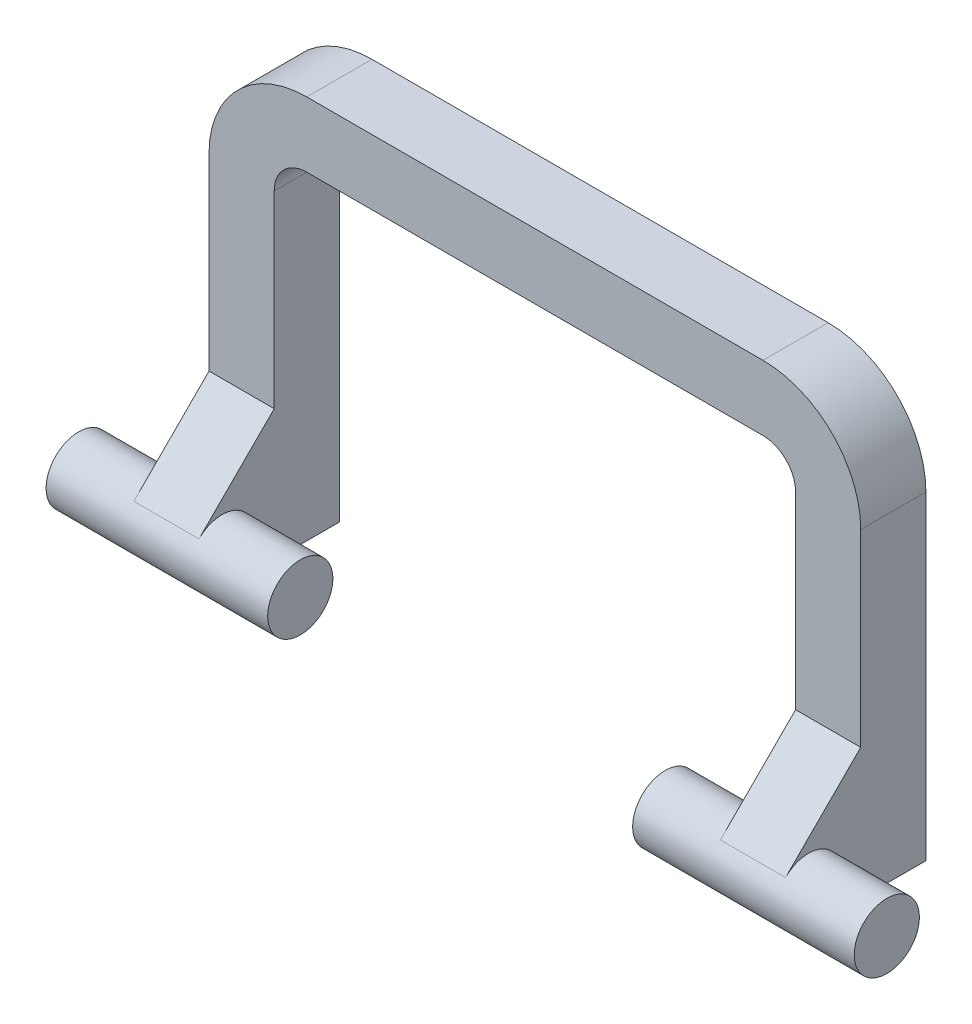
ISO-10303-21;
HEADER;
FILE_DESCRIPTION(('STEP AP214'),'2;1');
FILE_NAME('part.step','',(''),(''),'','','');
FILE_SCHEMA(('AUTOMOTIVE_DESIGN { 1 0 10303 214 1 1 1 1 }'));
ENDSEC;
DATA;
#1=APPLICATION_CONTEXT('core data for automotive mechanical design processes');
#2=APPLICATION_PROTOCOL_DEFINITION('international standard','automotive_design',2000,#1);
#3=PRODUCT_CONTEXT('',#1,'mechanical');
#4=PRODUCT('Part','Part','',(#3));
#5=PRODUCT_RELATED_PRODUCT_CATEGORY('part','',(#4));
#6=PRODUCT_DEFINITION_FORMATION('','',#4);
#7=PRODUCT_DEFINITION_CONTEXT('part definition',#1,'design');
#8=PRODUCT_DEFINITION('design','',#6,#7);
#9=PRODUCT_DEFINITION_SHAPE('','',#8);
#10=(LENGTH_UNIT() NAMED_UNIT(*) SI_UNIT(.MILLI.,.METRE.));
#11=(NAMED_UNIT(*) PLANE_ANGLE_UNIT() SI_UNIT($,.RADIAN.));
#12=(NAMED_UNIT(*) SI_UNIT($,.STERADIAN.) SOLID_ANGLE_UNIT());
#13=UNCERTAINTY_MEASURE_WITH_UNIT(LENGTH_MEASURE(1.E-05),#10,'distance_accuracy_value','');
#14=(GEOMETRIC_REPRESENTATION_CONTEXT(3) GLOBAL_UNCERTAINTY_ASSIGNED_CONTEXT((#13)) GLOBAL_UNIT_ASSIGNED_CONTEXT((#10,
#11,#12)) REPRESENTATION_CONTEXT('',''));
#15=CARTESIAN_POINT('',(0.,0.,0.));
#16=DIRECTION('',(0.,0.,1.));
#17=DIRECTION('',(1.,0.,0.));
#18=AXIS2_PLACEMENT_3D('',#15,#16,#17);
#19=CARTESIAN_POINT('',(35.0000000000001,49.,10.));
#20=DIRECTION('',(0.,0.,1.));
#21=DIRECTION('',(1.,0.,0.));
#22=AXIS2_PLACEMENT_3D('',#19,#20,#21);
#23=PLANE('',#22);
#24=DIRECTION('',(0.,1.,0.));
#25=VECTOR('',#24,1.);
#26=CARTESIAN_POINT('',(-49.9999999999999,0.,10.));
#27=LINE('',#26,#25);
#28=CARTESIAN_POINT('',(-49.9999999999999,20.0710678118656,10.));
#29=VERTEX_POINT('',#28);
#30=CARTESIAN_POINT('',(-49.9999999999999,49.,10.));
#31=VERTEX_POINT('',#30);
#32=EDGE_CURVE('E234',#29,#31,#27,.T.);
#33=ORIENTED_EDGE('',*,*,#32,.F.);
#34=DIRECTION('',(-1.,0.,0.));
#35=VECTOR('',#34,1.);
#36=CARTESIAN_POINT('',(-40.0000000000001,20.0710678118656,10.));
#37=LINE('',#36,#35);
#38=CARTESIAN_POINT('',(-40.0000000000001,20.0710678118656,10.));
#39=VERTEX_POINT('',#38);
#40=EDGE_CURVE('E264',#39,#29,#37,.T.);
#41=ORIENTED_EDGE('',*,*,#40,.F.);
#42=DIRECTION('',(0.,1.,0.));
#43=VECTOR('',#42,1.);
#44=CARTESIAN_POINT('',(-39.9999999999999,0.,10.));
#45=LINE('',#44,#43);
#46=CARTESIAN_POINT('',(-39.9999999999999,49.,10.));
#47=VERTEX_POINT('',#46);
#48=EDGE_CURVE('E135',#39,#47,#45,.T.);
#49=ORIENTED_EDGE('',*,*,#48,.T.);
#50=CARTESIAN_POINT('',(-34.9999999999999,49.,10.));
#51=DIRECTION('',(0.,0.,1.));
#52=DIRECTION('',(1.,0.,0.));
#53=AXIS2_PLACEMENT_3D('',#50,#51,#52);
#54=CIRCLE('',#53,5.);
#55=CARTESIAN_POINT('',(-34.9999999999999,54.,10.));
#56=VERTEX_POINT('',#55);
#57=EDGE_CURVE('E127',#47,#56,#54,.F.);
#58=ORIENTED_EDGE('',*,*,#57,.T.);
#59=DIRECTION('',(1.,0.,0.));
#60=VECTOR('',#59,1.);
#61=CARTESIAN_POINT('',(-34.9999999999999,54.,10.));
#62=LINE('',#61,#60);
#63=CARTESIAN_POINT('',(35.0000000000001,54.,10.));
#64=VERTEX_POINT('',#63);
#65=EDGE_CURVE('E131',#56,#64,#62,.T.);
#66=ORIENTED_EDGE('',*,*,#65,.T.);
#67=CARTESIAN_POINT('',(35.0000000000001,49.,10.));
#68=DIRECTION('',(0.,0.,1.));
#69=DIRECTION('',(1.,0.,0.));
#70=AXIS2_PLACEMENT_3D('',#67,#68,#69);
#71=CIRCLE('',#70,5.);
#72=CARTESIAN_POINT('',(40.0000000000001,49.,10.));
#73=VERTEX_POINT('',#72);
#74=EDGE_CURVE('E57',#64,#73,#71,.F.);
#75=ORIENTED_EDGE('',*,*,#74,.T.);
#76=DIRECTION('',(0.,-1.,0.));
#77=VECTOR('',#76,1.);
#78=CARTESIAN_POINT('',(40.0000000000001,0.,10.));
#79=LINE('',#78,#77);
#80=CARTESIAN_POINT('',(40.0000000000001,20.0710678118656,10.));
#81=VERTEX_POINT('',#80);
#82=EDGE_CURVE('E184',#73,#81,#79,.T.);
#83=ORIENTED_EDGE('',*,*,#82,.T.);
#84=DIRECTION('',(1.,0.,0.));
#85=VECTOR('',#84,1.);
#86=CARTESIAN_POINT('',(40.0000000000001,20.0710678118656,10.));
#87=LINE('',#86,#85);
#88=CARTESIAN_POINT('',(50.0000000000001,20.0710678118656,10.));
#89=VERTEX_POINT('',#88);
#90=EDGE_CURVE('E287',#81,#89,#87,.T.);
#91=ORIENTED_EDGE('',*,*,#90,.T.);
#92=DIRECTION('',(0.,-1.,0.));
#93=VECTOR('',#92,1.);
#94=CARTESIAN_POINT('',(50.0000000000001,0.,10.));
#95=LINE('',#94,#93);
#96=CARTESIAN_POINT('',(50.0000000000001,49.,10.));
#97=VERTEX_POINT('',#96);
#98=EDGE_CURVE('E225',#97,#89,#95,.T.);
#99=ORIENTED_EDGE('',*,*,#98,.F.);
#100=CARTESIAN_POINT('',(35.0000000000001,49.,10.));
#101=DIRECTION('',(0.,0.,1.));
#102=DIRECTION('',(1.,0.,0.));
#103=AXIS2_PLACEMENT_3D('',#100,#101,#102);
#104=CIRCLE('',#103,15.);
#105=CARTESIAN_POINT('',(35.0000000000001,64.,10.));
#106=VERTEX_POINT('',#105);
#107=EDGE_CURVE('E221',#106,#97,#104,.F.);
#108=ORIENTED_EDGE('',*,*,#107,.F.);
#109=DIRECTION('',(1.,0.,0.));
#110=VECTOR('',#109,1.);
#111=CARTESIAN_POINT('',(-34.9999999999999,64.,10.));
#112=LINE('',#111,#110);
#113=CARTESIAN_POINT('',(-34.9999999999999,64.,10.));
#114=VERTEX_POINT('',#113);
#115=EDGE_CURVE('E224',#114,#106,#112,.T.);
#116=ORIENTED_EDGE('',*,*,#115,.F.);
#117=CARTESIAN_POINT('',(-34.9999999999999,49.,10.));
#118=DIRECTION('',(0.,0.,1.));
#119=DIRECTION('',(1.,0.,0.));
#120=AXIS2_PLACEMENT_3D('',#117,#118,#119);
#121=CIRCLE('',#120,15.);
#122=EDGE_CURVE('E227',#31,#114,#121,.F.);
#123=ORIENTED_EDGE('',*,*,#122,.F.);
#124=EDGE_LOOP('',(#33,#41,#49,#58,#66,#75,#83,#91,#99,#108,#116,#123));
#125=FACE_BOUND('',#124,.T.);
#126=ADVANCED_FACE('F33',(#125),#23,.T.);
#127=CARTESIAN_POINT('',(40.0000000000001,0.,10.));
#128=DIRECTION('',(1.,0.,0.));
#129=DIRECTION('',(0.,1.,0.));
#130=AXIS2_PLACEMENT_3D('',#127,#128,#129);
#131=PLANE('',#130);
#132=CARTESIAN_POINT('',(40.0000000000001,4.99999999999999,18.));
#133=DIRECTION('',(-1.,0.,0.));
#134=DIRECTION('',(0.,0.,1.));
#135=AXIS2_PLACEMENT_3D('',#132,#133,#134);
#136=CIRCLE('',#135,5.00000000000001);
#137=CARTESIAN_POINT('',(40.0000000000001,8.53553390593271,21.5355339059328));
#138=VERTEX_POINT('',#137);
#139=CARTESIAN_POINT('',(40.0000000000001,0.,18.));
#140=VERTEX_POINT('',#139);
#141=EDGE_CURVE('E263',#138,#140,#136,.T.);
#142=ORIENTED_EDGE('',*,*,#141,.F.);
#143=DIRECTION('',(0.,-0.707106781186551,0.707106781186544));
#144=VECTOR('',#143,1.);
#145=CARTESIAN_POINT('',(40.0000000000001,8.53553390593273,21.5355339059328));
#146=LINE('',#145,#144);
#147=EDGE_CURVE('E280',#81,#138,#146,.T.);
#148=ORIENTED_EDGE('',*,*,#147,.F.);
#149=ORIENTED_EDGE('',*,*,#82,.F.);
#150=DIRECTION('',(0.,0.,-1.));
#151=VECTOR('',#150,1.);
#152=CARTESIAN_POINT('',(40.0000000000001,49.,10.));
#153=LINE('',#152,#151);
#154=CARTESIAN_POINT('',(40.0000000000001,49.,0.));
#155=VERTEX_POINT('',#154);
#156=EDGE_CURVE('E152',#73,#155,#153,.T.);
#157=ORIENTED_EDGE('',*,*,#156,.T.);
#158=DIRECTION('',(0.,-1.,0.));
#159=VECTOR('',#158,1.);
#160=CARTESIAN_POINT('',(40.0000000000001,0.,0.));
#161=LINE('',#160,#159);
#162=CARTESIAN_POINT('',(40.0000000000001,0.,0.));
#163=VERTEX_POINT('',#162);
#164=EDGE_CURVE('E156',#155,#163,#161,.T.);
#165=ORIENTED_EDGE('',*,*,#164,.T.);
#166=DIRECTION('',(0.,0.,-1.));
#167=VECTOR('',#166,1.);
#168=CARTESIAN_POINT('',(40.0000000000001,0.,10.));
#169=LINE('',#168,#167);
#170=EDGE_CURVE('E11',#140,#163,#169,.T.);
#171=ORIENTED_EDGE('',*,*,#170,.F.);
#172=EDGE_LOOP('',(#142,#148,#149,#157,#165,#171));
#173=FACE_BOUND('',#172,.T.);
#174=ADVANCED_FACE('F35',(#173),#131,.F.);
#175=CARTESIAN_POINT('',(50.0000000000001,0.,10.));
#176=DIRECTION('',(0.,-1.,0.));
#177=DIRECTION('',(1.,0.,0.));
#178=AXIS2_PLACEMENT_3D('',#175,#176,#177);
#179=PLANE('',#178);
#180=DIRECTION('',(-1.,0.,0.));
#181=VECTOR('',#180,1.);
#182=CARTESIAN_POINT('',(50.0000000000001,0.,0.));
#183=LINE('',#182,#181);
#184=CARTESIAN_POINT('',(50.0000000000001,0.,0.));
#185=VERTEX_POINT('',#184);
#186=EDGE_CURVE('E158',#185,#163,#183,.T.);
#187=ORIENTED_EDGE('',*,*,#186,.F.);
#188=DIRECTION('',(0.,0.,-1.));
#189=VECTOR('',#188,1.);
#190=CARTESIAN_POINT('',(50.0000000000001,0.,10.));
#191=LINE('',#190,#189);
#192=CARTESIAN_POINT('',(50.0000000000001,0.,18.));
#193=VERTEX_POINT('',#192);
#194=EDGE_CURVE('E41',#193,#185,#191,.T.);
#195=ORIENTED_EDGE('',*,*,#194,.F.);
#196=DIRECTION('',(1.,0.,0.));
#197=VECTOR('',#196,1.);
#198=CARTESIAN_POINT('',(40.0000000000001,0.,18.));
#199=LINE('',#198,#197);
#200=EDGE_CURVE('E283',#140,#193,#199,.T.);
#201=ORIENTED_EDGE('',*,*,#200,.F.);
#202=ORIENTED_EDGE('',*,*,#170,.T.);
#203=EDGE_LOOP('',(#187,#195,#201,#202));
#204=FACE_BOUND('',#203,.T.);
#205=ADVANCED_FACE('F210',(#204),#179,.T.);
#206=CARTESIAN_POINT('',(50.0000000000001,0.,10.));
#207=DIRECTION('',(1.,0.,0.));
#208=DIRECTION('',(0.,1.,0.));
#209=AXIS2_PLACEMENT_3D('',#206,#207,#208);
#210=PLANE('',#209);
#211=DIRECTION('',(0.,-0.707106781186551,0.707106781186544));
#212=VECTOR('',#211,1.);
#213=CARTESIAN_POINT('',(50.0000000000001,8.53553390593273,21.5355339059328));
#214=LINE('',#213,#212);
#215=CARTESIAN_POINT('',(50.0000000000001,8.53553390593273,21.5355339059328));
#216=VERTEX_POINT('',#215);
#217=EDGE_CURVE('E278',#89,#216,#214,.T.);
#218=ORIENTED_EDGE('',*,*,#217,.T.);
#219=CARTESIAN_POINT('',(50.0000000000001,4.99999999999999,18.));
#220=DIRECTION('',(1.,0.,0.));
#221=DIRECTION('',(0.,0.,-1.));
#222=AXIS2_PLACEMENT_3D('',#219,#220,#221);
#223=CIRCLE('',#222,5.);
#224=EDGE_CURVE('E207',#193,#216,#223,.T.);
#225=ORIENTED_EDGE('',*,*,#224,.F.);
#226=ORIENTED_EDGE('',*,*,#194,.T.);
#227=DIRECTION('',(0.,-1.,0.));
#228=VECTOR('',#227,1.);
#229=CARTESIAN_POINT('',(50.0000000000001,0.,0.));
#230=LINE('',#229,#228);
#231=CARTESIAN_POINT('',(50.0000000000001,49.,0.));
#232=VERTEX_POINT('',#231);
#233=EDGE_CURVE('E162',#232,#185,#230,.T.);
#234=ORIENTED_EDGE('',*,*,#233,.F.);
#235=DIRECTION('',(0.,0.,-1.));
#236=VECTOR('',#235,1.);
#237=CARTESIAN_POINT('',(50.0000000000001,49.,10.));
#238=LINE('',#237,#236);
#239=EDGE_CURVE('E110',#97,#232,#238,.T.);
#240=ORIENTED_EDGE('',*,*,#239,.F.);
#241=ORIENTED_EDGE('',*,*,#98,.T.);
#242=EDGE_LOOP('',(#218,#225,#226,#234,#240,#241));
#243=FACE_BOUND('',#242,.T.);
#244=ADVANCED_FACE('F204',(#243),#210,.T.);
#245=CARTESIAN_POINT('',(35.0000000000001,49.,10.));
#246=DIRECTION('',(0.,0.,-1.));
#247=DIRECTION('',(-1.,0.,0.));
#248=AXIS2_PLACEMENT_3D('',#245,#246,#247);
#249=CYLINDRICAL_SURFACE('',#248,15.);
#250=CARTESIAN_POINT('',(35.0000000000001,49.,0.));
#251=DIRECTION('',(0.,0.,1.));
#252=DIRECTION('',(1.,0.,0.));
#253=AXIS2_PLACEMENT_3D('',#250,#251,#252);
#254=CIRCLE('',#253,15.);
#255=CARTESIAN_POINT('',(35.0000000000001,64.,0.));
#256=VERTEX_POINT('',#255);
#257=EDGE_CURVE('E164',#256,#232,#254,.F.);
#258=ORIENTED_EDGE('',*,*,#257,.F.);
#259=DIRECTION('',(0.,0.,-1.));
#260=VECTOR('',#259,1.);
#261=CARTESIAN_POINT('',(35.0000000000001,64.,10.));
#262=LINE('',#261,#260);
#263=EDGE_CURVE('E197',#106,#256,#262,.T.);
#264=ORIENTED_EDGE('',*,*,#263,.F.);
#265=ORIENTED_EDGE('',*,*,#107,.T.);
#266=ORIENTED_EDGE('',*,*,#239,.T.);
#267=EDGE_LOOP('',(#258,#264,#265,#266));
#268=FACE_BOUND('',#267,.T.);
#269=ADVANCED_FACE('F218',(#268),#249,.T.);
#270=CARTESIAN_POINT('',(-34.9999999999999,64.,10.));
#271=DIRECTION('',(0.,1.,0.));
#272=DIRECTION('',(0.,0.,1.));
#273=AXIS2_PLACEMENT_3D('',#270,#271,#272);
#274=PLANE('',#273);
#275=DIRECTION('',(1.,0.,0.));
#276=VECTOR('',#275,1.);
#277=CARTESIAN_POINT('',(-34.9999999999999,64.,0.));
#278=LINE('',#277,#276);
#279=CARTESIAN_POINT('',(-34.9999999999999,64.,0.));
#280=VERTEX_POINT('',#279);
#281=EDGE_CURVE('E167',#280,#256,#278,.T.);
#282=ORIENTED_EDGE('',*,*,#281,.F.);
#283=DIRECTION('',(0.,0.,-1.));
#284=VECTOR('',#283,1.);
#285=CARTESIAN_POINT('',(-34.9999999999999,64.,10.));
#286=LINE('',#285,#284);
#287=EDGE_CURVE('E195',#114,#280,#286,.T.);
#288=ORIENTED_EDGE('',*,*,#287,.F.);
#289=ORIENTED_EDGE('',*,*,#115,.T.);
#290=ORIENTED_EDGE('',*,*,#263,.T.);
#291=EDGE_LOOP('',(#282,#288,#289,#290));
#292=FACE_BOUND('',#291,.T.);
#293=ADVANCED_FACE('F243',(#292),#274,.T.);
#294=CARTESIAN_POINT('',(-34.9999999999999,49.,10.));
#295=DIRECTION('',(0.,0.,-1.));
#296=DIRECTION('',(-1.,0.,0.));
#297=AXIS2_PLACEMENT_3D('',#294,#295,#296);
#298=CYLINDRICAL_SURFACE('',#297,15.);
#299=CARTESIAN_POINT('',(-34.9999999999999,49.,0.));
#300=DIRECTION('',(0.,0.,1.));
#301=DIRECTION('',(1.,0.,0.));
#302=AXIS2_PLACEMENT_3D('',#299,#300,#301);
#303=CIRCLE('',#302,15.);
#304=CARTESIAN_POINT('',(-49.9999999999999,49.,0.));
#305=VERTEX_POINT('',#304);
#306=EDGE_CURVE('E170',#305,#280,#303,.F.);
#307=ORIENTED_EDGE('',*,*,#306,.F.);
#308=DIRECTION('',(0.,0.,-1.));
#309=VECTOR('',#308,1.);
#310=CARTESIAN_POINT('',(-49.9999999999999,49.,10.));
#311=LINE('',#310,#309);
#312=EDGE_CURVE('E192',#31,#305,#311,.T.);
#313=ORIENTED_EDGE('',*,*,#312,.F.);
#314=ORIENTED_EDGE('',*,*,#122,.T.);
#315=ORIENTED_EDGE('',*,*,#287,.T.);
#316=EDGE_LOOP('',(#307,#313,#314,#315));
#317=FACE_BOUND('',#316,.T.);
#318=ADVANCED_FACE('F241',(#317),#298,.T.);
#319=CARTESIAN_POINT('',(-49.9999999999999,0.,10.));
#320=DIRECTION('',(-1.,0.,0.));
#321=DIRECTION('',(0.,0.,1.));
#322=AXIS2_PLACEMENT_3D('',#319,#320,#321);
#323=PLANE('',#322);
#324=CARTESIAN_POINT('',(-50.0000000000001,4.99999999999999,18.));
#325=DIRECTION('',(1.,0.,0.));
#326=DIRECTION('',(0.,0.,-1.));
#327=AXIS2_PLACEMENT_3D('',#324,#325,#326);
#328=CIRCLE('',#327,5.);
#329=CARTESIAN_POINT('',(-50.0000000000001,0.,18.));
#330=VERTEX_POINT('',#329);
#331=CARTESIAN_POINT('',(-50.0000000000001,8.53553390593272,21.5355339059328));
#332=VERTEX_POINT('',#331);
#333=EDGE_CURVE('E251',#330,#332,#328,.T.);
#334=ORIENTED_EDGE('',*,*,#333,.T.);
#335=DIRECTION('',(0.,-0.707106781186551,0.707106781186544));
#336=VECTOR('',#335,1.);
#337=CARTESIAN_POINT('',(-50.0000000000001,8.53553390593273,21.5355339059328));
#338=LINE('',#337,#336);
#339=EDGE_CURVE('E48',#29,#332,#338,.T.);
#340=ORIENTED_EDGE('',*,*,#339,.F.);
#341=ORIENTED_EDGE('',*,*,#32,.T.);
#342=ORIENTED_EDGE('',*,*,#312,.T.);
#343=DIRECTION('',(0.,1.,0.));
#344=VECTOR('',#343,1.);
#345=CARTESIAN_POINT('',(-49.9999999999999,0.,0.));
#346=LINE('',#345,#344);
#347=CARTESIAN_POINT('',(-49.9999999999999,0.,0.));
#348=VERTEX_POINT('',#347);
#349=EDGE_CURVE('E173',#348,#305,#346,.T.);
#350=ORIENTED_EDGE('',*,*,#349,.F.);
#351=DIRECTION('',(0.,0.,-1.));
#352=VECTOR('',#351,1.);
#353=CARTESIAN_POINT('',(-49.9999999999999,0.,10.));
#354=LINE('',#353,#352);
#355=EDGE_CURVE('E190',#330,#348,#354,.T.);
#356=ORIENTED_EDGE('',*,*,#355,.F.);
#357=EDGE_LOOP('',(#334,#340,#341,#342,#350,#356));
#358=FACE_BOUND('',#357,.T.);
#359=ADVANCED_FACE('F236',(#358),#323,.T.);
#360=CARTESIAN_POINT('',(-39.9999999999999,0.,10.));
#361=DIRECTION('',(0.,-1.,0.));
#362=DIRECTION('',(0.,0.,-1.));
#363=AXIS2_PLACEMENT_3D('',#360,#361,#362);
#364=PLANE('',#363);
#365=DIRECTION('',(-1.,0.,0.));
#366=VECTOR('',#365,1.);
#367=CARTESIAN_POINT('',(-39.9999999999999,0.,0.));
#368=LINE('',#367,#366);
#369=CARTESIAN_POINT('',(-39.9999999999999,0.,0.));
#370=VERTEX_POINT('',#369);
#371=EDGE_CURVE('E175',#370,#348,#368,.T.);
#372=ORIENTED_EDGE('',*,*,#371,.F.);
#373=DIRECTION('',(0.,0.,-1.));
#374=VECTOR('',#373,1.);
#375=CARTESIAN_POINT('',(-39.9999999999999,0.,10.));
#376=LINE('',#375,#374);
#377=CARTESIAN_POINT('',(-40.0000000000001,0.,18.));
#378=VERTEX_POINT('',#377);
#379=EDGE_CURVE('E188',#378,#370,#376,.T.);
#380=ORIENTED_EDGE('',*,*,#379,.F.);
#381=DIRECTION('',(-1.,0.,0.));
#382=VECTOR('',#381,1.);
#383=CARTESIAN_POINT('',(-40.0000000000001,0.,18.));
#384=LINE('',#383,#382);
#385=EDGE_CURVE('E258',#378,#330,#384,.T.);
#386=ORIENTED_EDGE('',*,*,#385,.T.);
#387=ORIENTED_EDGE('',*,*,#355,.T.);
#388=EDGE_LOOP('',(#372,#380,#386,#387));
#389=FACE_BOUND('',#388,.T.);
#390=ADVANCED_FACE('F259',(#389),#364,.T.);
#391=CARTESIAN_POINT('',(-39.9999999999999,0.,10.));
#392=DIRECTION('',(-1.,0.,0.));
#393=DIRECTION('',(0.,0.,1.));
#394=AXIS2_PLACEMENT_3D('',#391,#392,#393);
#395=PLANE('',#394);
#396=DIRECTION('',(0.,-0.707106781186551,0.707106781186544));
#397=VECTOR('',#396,1.);
#398=CARTESIAN_POINT('',(-40.0000000000001,8.53553390593273,21.5355339059328));
#399=LINE('',#398,#397);
#400=CARTESIAN_POINT('',(-40.0000000000001,8.53553390593273,21.5355339059328));
#401=VERTEX_POINT('',#400);
#402=EDGE_CURVE('E276',#39,#401,#399,.T.);
#403=ORIENTED_EDGE('',*,*,#402,.T.);
#404=CARTESIAN_POINT('',(-40.0000000000001,4.99999999999999,18.));
#405=DIRECTION('',(-1.,0.,0.));
#406=DIRECTION('',(0.,0.,1.));
#407=AXIS2_PLACEMENT_3D('',#404,#405,#406);
#408=CIRCLE('',#407,5.00000000000001);
#409=EDGE_CURVE('E316',#401,#378,#408,.T.);
#410=ORIENTED_EDGE('',*,*,#409,.T.);
#411=ORIENTED_EDGE('',*,*,#379,.T.);
#412=DIRECTION('',(0.,1.,0.));
#413=VECTOR('',#412,1.);
#414=CARTESIAN_POINT('',(-39.9999999999999,0.,0.));
#415=LINE('',#414,#413);
#416=CARTESIAN_POINT('',(-39.9999999999999,49.,0.));
#417=VERTEX_POINT('',#416);
#418=EDGE_CURVE('E178',#370,#417,#415,.T.);
#419=ORIENTED_EDGE('',*,*,#418,.T.);
#420=DIRECTION('',(0.,0.,-1.));
#421=VECTOR('',#420,1.);
#422=CARTESIAN_POINT('',(-39.9999999999999,49.,10.));
#423=LINE('',#422,#421);
#424=EDGE_CURVE('E147',#47,#417,#423,.T.);
#425=ORIENTED_EDGE('',*,*,#424,.F.);
#426=ORIENTED_EDGE('',*,*,#48,.F.);
#427=EDGE_LOOP('',(#403,#410,#411,#419,#425,#426));
#428=FACE_BOUND('',#427,.T.);
#429=ADVANCED_FACE('F334',(#428),#395,.F.);
#430=CARTESIAN_POINT('',(-34.9999999999999,49.,10.));
#431=DIRECTION('',(0.,0.,-1.));
#432=DIRECTION('',(-1.,0.,0.));
#433=AXIS2_PLACEMENT_3D('',#430,#431,#432);
#434=CYLINDRICAL_SURFACE('',#433,5.);
#435=CARTESIAN_POINT('',(-34.9999999999999,49.,0.));
#436=DIRECTION('',(0.,0.,1.));
#437=DIRECTION('',(1.,0.,0.));
#438=AXIS2_PLACEMENT_3D('',#435,#436,#437);
#439=CIRCLE('',#438,5.);
#440=CARTESIAN_POINT('',(-34.9999999999999,54.,0.));
#441=VERTEX_POINT('',#440);
#442=EDGE_CURVE('E144',#417,#441,#439,.F.);
#443=ORIENTED_EDGE('',*,*,#442,.T.);
#444=DIRECTION('',(0.,0.,-1.));
#445=VECTOR('',#444,1.);
#446=CARTESIAN_POINT('',(-34.9999999999999,54.,10.));
#447=LINE('',#446,#445);
#448=EDGE_CURVE('E141',#56,#441,#447,.T.);
#449=ORIENTED_EDGE('',*,*,#448,.F.);
#450=ORIENTED_EDGE('',*,*,#57,.F.);
#451=ORIENTED_EDGE('',*,*,#424,.T.);
#452=EDGE_LOOP('',(#443,#449,#450,#451));
#453=FACE_BOUND('',#452,.T.);
#454=ADVANCED_FACE('F142',(#453),#434,.F.);
#455=CARTESIAN_POINT('',(-34.9999999999999,54.,10.));
#456=DIRECTION('',(0.,1.,0.));
#457=DIRECTION('',(0.,0.,1.));
#458=AXIS2_PLACEMENT_3D('',#455,#456,#457);
#459=PLANE('',#458);
#460=DIRECTION('',(1.,0.,0.));
#461=VECTOR('',#460,1.);
#462=CARTESIAN_POINT('',(-34.9999999999999,54.,0.));
#463=LINE('',#462,#461);
#464=CARTESIAN_POINT('',(35.0000000000001,54.,0.));
#465=VERTEX_POINT('',#464);
#466=EDGE_CURVE('E181',#441,#465,#463,.T.);
#467=ORIENTED_EDGE('',*,*,#466,.T.);
#468=DIRECTION('',(0.,0.,-1.));
#469=VECTOR('',#468,1.);
#470=CARTESIAN_POINT('',(35.0000000000001,54.,10.));
#471=LINE('',#470,#469);
#472=EDGE_CURVE('E148',#64,#465,#471,.T.);
#473=ORIENTED_EDGE('',*,*,#472,.F.);
#474=ORIENTED_EDGE('',*,*,#65,.F.);
#475=ORIENTED_EDGE('',*,*,#448,.T.);
#476=EDGE_LOOP('',(#467,#473,#474,#475));
#477=FACE_BOUND('',#476,.T.);
#478=ADVANCED_FACE('F150',(#477),#459,.F.);
#479=CARTESIAN_POINT('',(35.0000000000001,49.,10.));
#480=DIRECTION('',(0.,0.,-1.));
#481=DIRECTION('',(-1.,0.,0.));
#482=AXIS2_PLACEMENT_3D('',#479,#480,#481);
#483=CYLINDRICAL_SURFACE('',#482,5.);
#484=CARTESIAN_POINT('',(35.0000000000001,49.,0.));
#485=DIRECTION('',(0.,0.,1.));
#486=DIRECTION('',(1.,0.,0.));
#487=AXIS2_PLACEMENT_3D('',#484,#485,#486);
#488=CIRCLE('',#487,5.);
#489=EDGE_CURVE('E102',#465,#155,#488,.F.);
#490=ORIENTED_EDGE('',*,*,#489,.T.);
#491=ORIENTED_EDGE('',*,*,#156,.F.);
#492=ORIENTED_EDGE('',*,*,#74,.F.);
#493=ORIENTED_EDGE('',*,*,#472,.T.);
#494=EDGE_LOOP('',(#490,#491,#492,#493));
#495=FACE_BOUND('',#494,.T.);
#496=ADVANCED_FACE('F337',(#495),#483,.F.);
#497=CARTESIAN_POINT('',(35.0000000000001,49.,0.));
#498=DIRECTION('',(0.,0.,1.));
#499=DIRECTION('',(1.,0.,0.));
#500=AXIS2_PLACEMENT_3D('',#497,#498,#499);
#501=PLANE('',#500);
#502=ORIENTED_EDGE('',*,*,#349,.T.);
#503=ORIENTED_EDGE('',*,*,#306,.T.);
#504=ORIENTED_EDGE('',*,*,#281,.T.);
#505=ORIENTED_EDGE('',*,*,#257,.T.);
#506=ORIENTED_EDGE('',*,*,#233,.T.);
#507=ORIENTED_EDGE('',*,*,#186,.T.);
#508=ORIENTED_EDGE('',*,*,#164,.F.);
#509=ORIENTED_EDGE('',*,*,#489,.F.);
#510=ORIENTED_EDGE('',*,*,#466,.F.);
#511=ORIENTED_EDGE('',*,*,#442,.F.);
#512=ORIENTED_EDGE('',*,*,#418,.F.);
#513=ORIENTED_EDGE('',*,*,#371,.T.);
#514=EDGE_LOOP('',(#502,#503,#504,#505,#506,#507,#508,#509,#510,#511,#512,#513));
#515=FACE_BOUND('',#514,.T.);
#516=ADVANCED_FACE('F214',(#515),#501,.F.);
#517=CARTESIAN_POINT('',(40.0000000000001,4.99999999999999,18.));
#518=DIRECTION('',(1.,0.,0.));
#519=DIRECTION('',(0.,0.,-1.));
#520=AXIS2_PLACEMENT_3D('',#517,#518,#519);
#521=CYLINDRICAL_SURFACE('',#520,5.);
#522=ORIENTED_EDGE('',*,*,#200,.T.);
#523=ORIENTED_EDGE('',*,*,#224,.T.);
#524=DIRECTION('',(1.,0.,0.));
#525=VECTOR('',#524,1.);
#526=CARTESIAN_POINT('',(40.0000000000001,8.53553390593273,21.5355339059328));
#527=LINE('',#526,#525);
#528=EDGE_CURVE('E159',#138,#216,#527,.T.);
#529=ORIENTED_EDGE('',*,*,#528,.F.);
#530=ORIENTED_EDGE('',*,*,#141,.T.);
#531=EDGE_LOOP('',(#522,#523,#529,#530));
#532=FACE_BOUND('',#531,.T.);
#533=CARTESIAN_POINT('',(28.0000000000001,4.99999999999999,18.));
#534=DIRECTION('',(-1.,0.,0.));
#535=DIRECTION('',(0.,0.,1.));
#536=AXIS2_PLACEMENT_3D('',#533,#534,#535);
#537=CIRCLE('',#536,5.00000000000001);
#538=CARTESIAN_POINT('',(28.0000000000001,4.99999999999999,23.));
#539=VERTEX_POINT('',#538);
#540=EDGE_CURVE('E267',#539,#539,#537,.T.);
#541=ORIENTED_EDGE('',*,*,#540,.F.);
#542=EDGE_LOOP('',(#541));
#543=FACE_BOUND('',#542,.T.);
#544=CARTESIAN_POINT('',(62.0000000000001,4.99999999999999,18.));
#545=DIRECTION('',(1.,0.,0.));
#546=DIRECTION('',(0.,0.,-1.));
#547=AXIS2_PLACEMENT_3D('',#544,#545,#546);
#548=CIRCLE('',#547,5.);
#549=CARTESIAN_POINT('',(62.0000000000001,4.99999999999999,13.));
#550=VERTEX_POINT('',#549);
#551=EDGE_CURVE('E312',#550,#550,#548,.T.);
#552=ORIENTED_EDGE('',*,*,#551,.F.);
#553=EDGE_LOOP('',(#552));
#554=FACE_BOUND('',#553,.T.);
#555=ADVANCED_FACE('F310',(#532,#543,#554),#521,.T.);
#556=CARTESIAN_POINT('',(40.0000000000001,8.53553390593273,21.5355339059328));
#557=DIRECTION('',(0.,0.707106781186544,0.707106781186551));
#558=DIRECTION('',(0.,-0.707106781186551,0.707106781186544));
#559=AXIS2_PLACEMENT_3D('',#556,#557,#558);
#560=PLANE('',#559);
#561=ORIENTED_EDGE('',*,*,#217,.F.);
#562=ORIENTED_EDGE('',*,*,#90,.F.);
#563=ORIENTED_EDGE('',*,*,#147,.T.);
#564=ORIENTED_EDGE('',*,*,#528,.T.);
#565=EDGE_LOOP('',(#561,#562,#563,#564));
#566=FACE_BOUND('',#565,.T.);
#567=ADVANCED_FACE('F303',(#566),#560,.T.);
#568=CARTESIAN_POINT('',(28.0000000000001,4.99999999999999,18.));
#569=DIRECTION('',(-1.,0.,0.));
#570=DIRECTION('',(0.,0.,1.));
#571=AXIS2_PLACEMENT_3D('',#568,#569,#570);
#572=PLANE('',#571);
#573=ORIENTED_EDGE('',*,*,#540,.T.);
#574=EDGE_LOOP('',(#573));
#575=FACE_BOUND('',#574,.T.);
#576=ADVANCED_FACE('F356',(#575),#572,.T.);
#577=CARTESIAN_POINT('',(-40.0000000000001,4.99999999999999,18.));
#578=DIRECTION('',(-1.,0.,0.));
#579=DIRECTION('',(0.,0.,1.));
#580=AXIS2_PLACEMENT_3D('',#577,#578,#579);
#581=CYLINDRICAL_SURFACE('',#580,5.);
#582=DIRECTION('',(-1.,0.,0.));
#583=VECTOR('',#582,1.);
#584=CARTESIAN_POINT('',(-40.0000000000001,8.53553390593273,21.5355339059328));
#585=LINE('',#584,#583);
#586=EDGE_CURVE('E269',#401,#332,#585,.T.);
#587=ORIENTED_EDGE('',*,*,#586,.T.);
#588=ORIENTED_EDGE('',*,*,#333,.F.);
#589=ORIENTED_EDGE('',*,*,#385,.F.);
#590=ORIENTED_EDGE('',*,*,#409,.F.);
#591=EDGE_LOOP('',(#587,#588,#589,#590));
#592=FACE_BOUND('',#591,.T.);
#593=CARTESIAN_POINT('',(-28.0000000000001,4.99999999999999,18.));
#594=DIRECTION('',(-1.,0.,0.));
#595=DIRECTION('',(0.,0.,1.));
#596=AXIS2_PLACEMENT_3D('',#593,#594,#595);
#597=CIRCLE('',#596,5.00000000000001);
#598=CARTESIAN_POINT('',(-28.0000000000001,4.99999999999999,23.));
#599=VERTEX_POINT('',#598);
#600=EDGE_CURVE('E322',#599,#599,#597,.T.);
#601=ORIENTED_EDGE('',*,*,#600,.T.);
#602=EDGE_LOOP('',(#601));
#603=FACE_BOUND('',#602,.T.);
#604=CARTESIAN_POINT('',(-62.0000000000001,4.99999999999999,18.));
#605=DIRECTION('',(1.,0.,0.));
#606=DIRECTION('',(0.,0.,-1.));
#607=AXIS2_PLACEMENT_3D('',#604,#605,#606);
#608=CIRCLE('',#607,5.);
#609=CARTESIAN_POINT('',(-62.0000000000001,4.99999999999999,13.));
#610=VERTEX_POINT('',#609);
#611=EDGE_CURVE('E313',#610,#610,#608,.T.);
#612=ORIENTED_EDGE('',*,*,#611,.T.);
#613=EDGE_LOOP('',(#612));
#614=FACE_BOUND('',#613,.T.);
#615=ADVANCED_FACE('F331',(#592,#603,#614),#581,.T.);
#616=CARTESIAN_POINT('',(-40.0000000000001,8.53553390593273,21.5355339059328));
#617=DIRECTION('',(0.,-0.707106781186544,-0.707106781186551));
#618=DIRECTION('',(0.,0.707106781186551,-0.707106781186544));
#619=AXIS2_PLACEMENT_3D('',#616,#617,#618);
#620=PLANE('',#619);
#621=ORIENTED_EDGE('',*,*,#339,.T.);
#622=ORIENTED_EDGE('',*,*,#586,.F.);
#623=ORIENTED_EDGE('',*,*,#402,.F.);
#624=ORIENTED_EDGE('',*,*,#40,.T.);
#625=EDGE_LOOP('',(#621,#622,#623,#624));
#626=FACE_BOUND('',#625,.T.);
#627=ADVANCED_FACE('F329',(#626),#620,.F.);
#628=CARTESIAN_POINT('',(-28.0000000000001,4.99999999999999,18.));
#629=DIRECTION('',(1.,0.,0.));
#630=DIRECTION('',(0.,0.,1.));
#631=AXIS2_PLACEMENT_3D('',#628,#629,#630);
#632=PLANE('',#631);
#633=ORIENTED_EDGE('',*,*,#600,.F.);
#634=EDGE_LOOP('',(#633));
#635=FACE_BOUND('',#634,.T.);
#636=ADVANCED_FACE('F364',(#635),#632,.T.);
#637=CARTESIAN_POINT('',(62.0000000000001,4.99999999999999,18.));
#638=DIRECTION('',(1.,0.,0.));
#639=DIRECTION('',(0.,0.,-1.));
#640=AXIS2_PLACEMENT_3D('',#637,#638,#639);
#641=PLANE('',#640);
#642=ORIENTED_EDGE('',*,*,#551,.T.);
#643=EDGE_LOOP('',(#642));
#644=FACE_BOUND('',#643,.T.);
#645=ADVANCED_FACE('F367',(#644),#641,.T.);
#646=CARTESIAN_POINT('',(-62.0000000000001,4.99999999999999,18.));
#647=DIRECTION('',(-1.,0.,0.));
#648=DIRECTION('',(0.,0.,-1.));
#649=AXIS2_PLACEMENT_3D('',#646,#647,#648);
#650=PLANE('',#649);
#651=ORIENTED_EDGE('',*,*,#611,.F.);
#652=EDGE_LOOP('',(#651));
#653=FACE_BOUND('',#652,.T.);
#654=ADVANCED_FACE('F371',(#653),#650,.T.);
#655=CLOSED_SHELL('',(#126,#174,#205,#244,#269,#293,#318,#359,#390,#429,#454,#478,#496,#516,
#555,#567,#576,#615,#627,#636,#645,#654));
#656=MANIFOLD_SOLID_BREP('B2',#655);
#657=ADVANCED_BREP_SHAPE_REPRESENTATION('',(#18,#656),#14);
#658=SHAPE_DEFINITION_REPRESENTATION(#9,#657);
ENDSEC;
END-ISO-10303-21;
